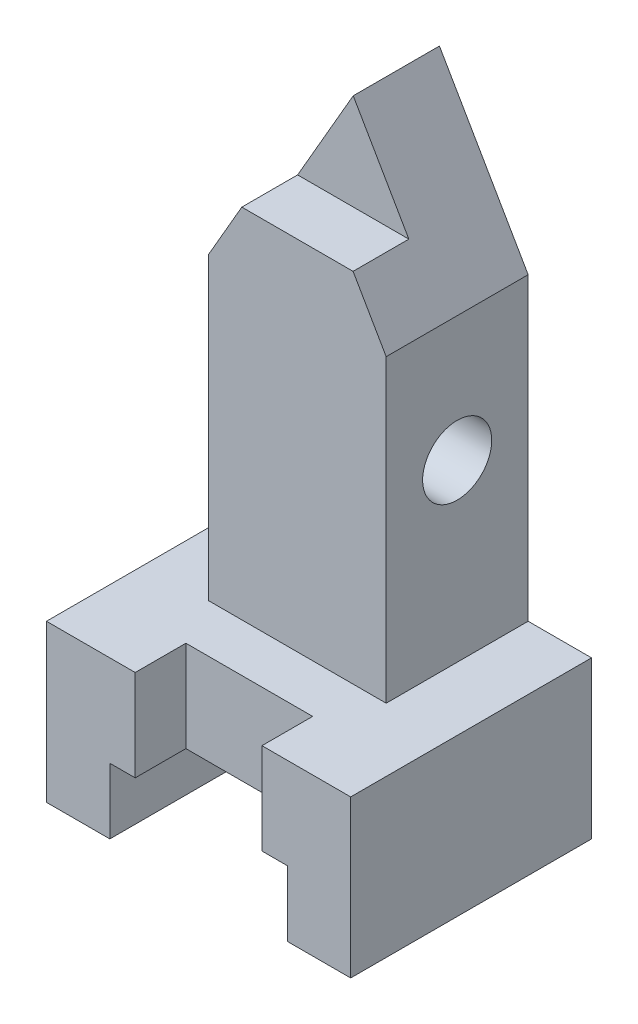
ISO-10303-21;
HEADER;
FILE_DESCRIPTION(('STEP AP214'),'2;1');
FILE_NAME('part.step','',(''),(''),'','','');
FILE_SCHEMA(('AUTOMOTIVE_DESIGN { 1 0 10303 214 1 1 1 1 }'));
ENDSEC;
DATA;
#1=APPLICATION_CONTEXT('core data for automotive mechanical design processes');
#2=APPLICATION_PROTOCOL_DEFINITION('international standard','automotive_design',2000,#1);
#3=PRODUCT_CONTEXT('',#1,'mechanical');
#4=PRODUCT('Part','Part','',(#3));
#5=PRODUCT_RELATED_PRODUCT_CATEGORY('part','',(#4));
#6=PRODUCT_DEFINITION_FORMATION('','',#4);
#7=PRODUCT_DEFINITION_CONTEXT('part definition',#1,'design');
#8=PRODUCT_DEFINITION('design','',#6,#7);
#9=PRODUCT_DEFINITION_SHAPE('','',#8);
#10=(LENGTH_UNIT() NAMED_UNIT(*) SI_UNIT(.MILLI.,.METRE.));
#11=(NAMED_UNIT(*) PLANE_ANGLE_UNIT() SI_UNIT($,.RADIAN.));
#12=(NAMED_UNIT(*) SI_UNIT($,.STERADIAN.) SOLID_ANGLE_UNIT());
#13=UNCERTAINTY_MEASURE_WITH_UNIT(LENGTH_MEASURE(1.E-05),#10,'distance_accuracy_value','');
#14=(GEOMETRIC_REPRESENTATION_CONTEXT(3) GLOBAL_UNCERTAINTY_ASSIGNED_CONTEXT((#13)) GLOBAL_UNIT_ASSIGNED_CONTEXT((#10,
#11,#12)) REPRESENTATION_CONTEXT('',''));
#15=CARTESIAN_POINT('',(0.,0.,0.));
#16=DIRECTION('',(0.,0.,1.));
#17=DIRECTION('',(1.,0.,0.));
#18=AXIS2_PLACEMENT_3D('',#15,#16,#17);
#19=CARTESIAN_POINT('',(0.,0.,53.6));
#20=DIRECTION('',(0.,0.,1.));
#21=DIRECTION('',(1.,0.,0.));
#22=AXIS2_PLACEMENT_3D('',#19,#20,#21);
#23=PLANE('',#22);
#24=DIRECTION('',(0.,1.,0.));
#25=VECTOR('',#24,1.);
#26=CARTESIAN_POINT('',(20.,0.,53.6));
#27=LINE('',#26,#25);
#28=CARTESIAN_POINT('',(20.,-28.8,53.6));
#29=VERTEX_POINT('',#28);
#30=CARTESIAN_POINT('',(20.,0.,53.6));
#31=VERTEX_POINT('',#30);
#32=EDGE_CURVE('E43',#29,#31,#27,.T.);
#33=ORIENTED_EDGE('',*,*,#32,.F.);
#34=DIRECTION('',(1.,0.,0.));
#35=VECTOR('',#34,1.);
#36=CARTESIAN_POINT('',(0.,-28.8,53.6));
#37=LINE('',#36,#35);
#38=CARTESIAN_POINT('',(28.,-28.8,53.6));
#39=VERTEX_POINT('',#38);
#40=EDGE_CURVE('E190',#29,#39,#37,.T.);
#41=ORIENTED_EDGE('',*,*,#40,.T.);
#42=DIRECTION('',(0.,-1.,0.));
#43=VECTOR('',#42,1.);
#44=CARTESIAN_POINT('',(28.,0.,53.6));
#45=LINE('',#44,#43);
#46=CARTESIAN_POINT('',(28.,-49.4898841207361,53.6));
#47=VERTEX_POINT('',#46);
#48=EDGE_CURVE('E189',#39,#47,#45,.T.);
#49=ORIENTED_EDGE('',*,*,#48,.T.);
#50=DIRECTION('',(1.,0.,0.));
#51=VECTOR('',#50,1.);
#52=CARTESIAN_POINT('',(0.,-49.4898841207361,53.6));
#53=LINE('',#52,#51);
#54=CARTESIAN_POINT('',(48.,-49.4898841207361,53.6));
#55=VERTEX_POINT('',#54);
#56=EDGE_CURVE('E315',#47,#55,#53,.T.);
#57=ORIENTED_EDGE('',*,*,#56,.T.);
#58=DIRECTION('',(0.,1.,0.));
#59=VECTOR('',#58,1.);
#60=CARTESIAN_POINT('',(48.,0.,53.6));
#61=LINE('',#60,#59);
#62=CARTESIAN_POINT('',(48.,0.,53.6));
#63=VERTEX_POINT('',#62);
#64=EDGE_CURVE('E311',#55,#63,#61,.T.);
#65=ORIENTED_EDGE('',*,*,#64,.T.);
#66=DIRECTION('',(1.,0.,0.));
#67=VECTOR('',#66,1.);
#68=CARTESIAN_POINT('',(0.,0.,53.6));
#69=LINE('',#68,#67);
#70=EDGE_CURVE('E306',#31,#63,#69,.T.);
#71=ORIENTED_EDGE('',*,*,#70,.F.);
#72=EDGE_LOOP('',(#33,#41,#49,#57,#65,#71));
#73=FACE_BOUND('',#72,.T.);
#74=ADVANCED_FACE('F35',(#73),#23,.T.);
#75=CARTESIAN_POINT('',(28.,94.7025773880715,22.4));
#76=DIRECTION('',(-1.,0.,0.));
#77=DIRECTION('',(0.,-1.,0.));
#78=AXIS2_PLACEMENT_3D('',#75,#76,#77);
#79=PLANE('',#78);
#80=CARTESIAN_POINT('',(28.,55.2,0.));
#81=DIRECTION('',(1.,0.,0.));
#82=DIRECTION('',(0.,1.,0.));
#83=AXIS2_PLACEMENT_3D('',#80,#81,#82);
#84=CIRCLE('',#83,10.9082116021349);
#85=CARTESIAN_POINT('',(28.,66.1082116021349,0.));
#86=VERTEX_POINT('',#85);
#87=EDGE_CURVE('E249',#86,#86,#84,.T.);
#88=ORIENTED_EDGE('',*,*,#87,.F.);
#89=EDGE_LOOP('',(#88));
#90=FACE_BOUND('',#89,.T.);
#91=DIRECTION('',(0.,1.,0.));
#92=VECTOR('',#91,1.);
#93=CARTESIAN_POINT('',(28.,94.7025773880715,-22.4));
#94=LINE('',#93,#92);
#95=CARTESIAN_POINT('',(28.,0.,-22.4));
#96=VERTEX_POINT('',#95);
#97=CARTESIAN_POINT('',(28.,94.7025773880715,-22.4));
#98=VERTEX_POINT('',#97);
#99=EDGE_CURVE('E253',#96,#98,#94,.T.);
#100=ORIENTED_EDGE('',*,*,#99,.T.);
#101=DIRECTION('',(0.,0.,-1.));
#102=VECTOR('',#101,1.);
#103=CARTESIAN_POINT('',(28.,94.7025773880715,22.4));
#104=LINE('',#103,#102);
#105=CARTESIAN_POINT('',(28.,94.7025773880715,22.4));
#106=VERTEX_POINT('',#105);
#107=EDGE_CURVE('E287',#106,#98,#104,.T.);
#108=ORIENTED_EDGE('',*,*,#107,.F.);
#109=DIRECTION('',(0.,1.,0.));
#110=VECTOR('',#109,1.);
#111=CARTESIAN_POINT('',(28.,94.7025773880715,22.4));
#112=LINE('',#111,#110);
#113=CARTESIAN_POINT('',(28.,0.,22.4));
#114=VERTEX_POINT('',#113);
#115=EDGE_CURVE('E256',#114,#106,#112,.T.);
#116=ORIENTED_EDGE('',*,*,#115,.F.);
#117=DIRECTION('',(0.,0.,-1.));
#118=VECTOR('',#117,1.);
#119=CARTESIAN_POINT('',(28.,0.,22.4));
#120=LINE('',#119,#118);
#121=EDGE_CURVE('E269',#114,#96,#120,.T.);
#122=ORIENTED_EDGE('',*,*,#121,.T.);
#123=EDGE_LOOP('',(#100,#108,#116,#122));
#124=FACE_BOUND('',#123,.T.);
#125=ADVANCED_FACE('F37',(#90,#124),#79,.F.);
#126=CARTESIAN_POINT('',(17.6669182372025,112.6,22.4));
#127=DIRECTION('',(-0.866025403784438,-0.5,0.));
#128=DIRECTION('',(0.5,-0.866025403784438,0.));
#129=AXIS2_PLACEMENT_3D('',#126,#127,#128);
#130=PLANE('',#129);
#131=DIRECTION('',(-0.5,0.866025403784438,0.));
#132=VECTOR('',#131,1.);
#133=CARTESIAN_POINT('',(17.6669182372025,112.6,4.8));
#134=LINE('',#133,#132);
#135=CARTESIAN_POINT('',(17.5514481833646,112.8,4.8));
#136=VERTEX_POINT('',#135);
#137=CARTESIAN_POINT('',(0.,143.2,4.8));
#138=VERTEX_POINT('',#137);
#139=EDGE_CURVE('E247',#136,#138,#134,.T.);
#140=ORIENTED_EDGE('',*,*,#139,.F.);
#141=DIRECTION('',(0.,0.,1.));
#142=VECTOR('',#141,1.);
#143=CARTESIAN_POINT('',(17.5514481833646,112.8,22.4));
#144=LINE('',#143,#142);
#145=CARTESIAN_POINT('',(17.5514481833646,112.8,22.4));
#146=VERTEX_POINT('',#145);
#147=EDGE_CURVE('E244',#136,#146,#144,.T.);
#148=ORIENTED_EDGE('',*,*,#147,.T.);
#149=DIRECTION('',(-0.500000000000001,0.866025403784438,0.));
#150=VECTOR('',#149,1.);
#151=CARTESIAN_POINT('',(17.6669182372025,112.6,22.4));
#152=LINE('',#151,#150);
#153=EDGE_CURVE('E259',#106,#146,#152,.T.);
#154=ORIENTED_EDGE('',*,*,#153,.F.);
#155=ORIENTED_EDGE('',*,*,#107,.T.);
#156=DIRECTION('',(-0.5,0.866025403784438,0.));
#157=VECTOR('',#156,1.);
#158=CARTESIAN_POINT('',(17.6669182372025,112.6,-22.4));
#159=LINE('',#158,#157);
#160=CARTESIAN_POINT('',(0.,143.2,-22.4));
#161=VERTEX_POINT('',#160);
#162=EDGE_CURVE('E272',#98,#161,#159,.T.);
#163=ORIENTED_EDGE('',*,*,#162,.T.);
#164=DIRECTION('',(0.,0.,-1.));
#165=VECTOR('',#164,1.);
#166=CARTESIAN_POINT('',(0.,143.2,22.4));
#167=LINE('',#166,#165);
#168=EDGE_CURVE('E285',#138,#161,#167,.T.);
#169=ORIENTED_EDGE('',*,*,#168,.F.);
#170=EDGE_LOOP('',(#140,#148,#154,#155,#163,#169));
#171=FACE_BOUND('',#170,.T.);
#172=ADVANCED_FACE('F372',(#171),#130,.F.);
#173=CARTESIAN_POINT('',(-17.6669182372025,112.6,22.4));
#174=DIRECTION('',(0.866025403784439,-0.5,0.));
#175=DIRECTION('',(0.5,0.866025403784439,0.));
#176=AXIS2_PLACEMENT_3D('',#173,#174,#175);
#177=PLANE('',#176);
#178=DIRECTION('',(-0.5,-0.866025403784439,0.));
#179=VECTOR('',#178,1.);
#180=CARTESIAN_POINT('',(0.,143.2,22.4));
#181=LINE('',#180,#179);
#182=CARTESIAN_POINT('',(-17.5514481833646,112.8,22.4));
#183=VERTEX_POINT('',#182);
#184=CARTESIAN_POINT('',(-28.,94.7025773880714,22.4));
#185=VERTEX_POINT('',#184);
#186=EDGE_CURVE('E263',#183,#185,#181,.T.);
#187=ORIENTED_EDGE('',*,*,#186,.F.);
#188=DIRECTION('',(0.,0.,-1.));
#189=VECTOR('',#188,1.);
#190=CARTESIAN_POINT('',(-17.5514481833646,112.8,22.4));
#191=LINE('',#190,#189);
#192=CARTESIAN_POINT('',(-17.5514481833646,112.8,4.8));
#193=VERTEX_POINT('',#192);
#194=EDGE_CURVE('E58',#183,#193,#191,.T.);
#195=ORIENTED_EDGE('',*,*,#194,.T.);
#196=DIRECTION('',(-0.5,-0.866025403784439,0.));
#197=VECTOR('',#196,1.);
#198=CARTESIAN_POINT('',(-17.6669182372025,112.6,4.8));
#199=LINE('',#198,#197);
#200=EDGE_CURVE('E173',#138,#193,#199,.T.);
#201=ORIENTED_EDGE('',*,*,#200,.F.);
#202=ORIENTED_EDGE('',*,*,#168,.T.);
#203=DIRECTION('',(-0.5,-0.866025403784438,0.));
#204=VECTOR('',#203,1.);
#205=CARTESIAN_POINT('',(-17.6669182372025,112.6,-22.4));
#206=LINE('',#205,#204);
#207=CARTESIAN_POINT('',(-28.,94.7025773880714,-22.4));
#208=VERTEX_POINT('',#207);
#209=EDGE_CURVE('E275',#161,#208,#206,.T.);
#210=ORIENTED_EDGE('',*,*,#209,.T.);
#211=DIRECTION('',(0.,0.,-1.));
#212=VECTOR('',#211,1.);
#213=CARTESIAN_POINT('',(-28.,94.7025773880714,22.4));
#214=LINE('',#213,#212);
#215=EDGE_CURVE('E282',#185,#208,#214,.T.);
#216=ORIENTED_EDGE('',*,*,#215,.F.);
#217=EDGE_LOOP('',(#187,#195,#201,#202,#210,#216));
#218=FACE_BOUND('',#217,.T.);
#219=ADVANCED_FACE('F376',(#218),#177,.F.);
#220=CARTESIAN_POINT('',(-28.,94.7025773880714,22.4));
#221=DIRECTION('',(1.,0.,0.));
#222=DIRECTION('',(0.,1.,0.));
#223=AXIS2_PLACEMENT_3D('',#220,#221,#222);
#224=PLANE('',#223);
#225=CARTESIAN_POINT('',(-28.,55.2,0.));
#226=DIRECTION('',(1.,0.,0.));
#227=DIRECTION('',(0.,1.,0.));
#228=AXIS2_PLACEMENT_3D('',#225,#226,#227);
#229=CIRCLE('',#228,10.9082116021349);
#230=CARTESIAN_POINT('',(-28.,66.1082116021349,0.));
#231=VERTEX_POINT('',#230);
#232=EDGE_CURVE('E250',#231,#231,#229,.T.);
#233=ORIENTED_EDGE('',*,*,#232,.T.);
#234=EDGE_LOOP('',(#233));
#235=FACE_BOUND('',#234,.T.);
#236=DIRECTION('',(0.,-1.,0.));
#237=VECTOR('',#236,1.);
#238=CARTESIAN_POINT('',(-28.,94.7025773880714,-22.4));
#239=LINE('',#238,#237);
#240=CARTESIAN_POINT('',(-28.,0.,-22.4));
#241=VERTEX_POINT('',#240);
#242=EDGE_CURVE('E260',#208,#241,#239,.T.);
#243=ORIENTED_EDGE('',*,*,#242,.T.);
#244=DIRECTION('',(0.,0.,-1.));
#245=VECTOR('',#244,1.);
#246=CARTESIAN_POINT('',(-28.,0.,22.4));
#247=LINE('',#246,#245);
#248=CARTESIAN_POINT('',(-28.,0.,22.4));
#249=VERTEX_POINT('',#248);
#250=EDGE_CURVE('E279',#249,#241,#247,.T.);
#251=ORIENTED_EDGE('',*,*,#250,.F.);
#252=DIRECTION('',(0.,-1.,0.));
#253=VECTOR('',#252,1.);
#254=CARTESIAN_POINT('',(-28.,94.7025773880714,22.4));
#255=LINE('',#254,#253);
#256=EDGE_CURVE('E265',#185,#249,#255,.T.);
#257=ORIENTED_EDGE('',*,*,#256,.F.);
#258=ORIENTED_EDGE('',*,*,#215,.T.);
#259=EDGE_LOOP('',(#243,#251,#257,#258));
#260=FACE_BOUND('',#259,.T.);
#261=ADVANCED_FACE('F359',(#235,#260),#224,.F.);
#262=CARTESIAN_POINT('',(0.,0.,22.4));
#263=DIRECTION('',(0.,0.,-1.));
#264=DIRECTION('',(-1.,0.,0.));
#265=AXIS2_PLACEMENT_3D('',#262,#263,#264);
#266=PLANE('',#265);
#267=ORIENTED_EDGE('',*,*,#153,.T.);
#268=DIRECTION('',(-1.,0.,0.));
#269=VECTOR('',#268,1.);
#270=CARTESIAN_POINT('',(0.,112.8,22.4));
#271=LINE('',#270,#269);
#272=EDGE_CURVE('E290',#146,#183,#271,.T.);
#273=ORIENTED_EDGE('',*,*,#272,.T.);
#274=ORIENTED_EDGE('',*,*,#186,.T.);
#275=ORIENTED_EDGE('',*,*,#256,.T.);
#276=DIRECTION('',(1.,0.,0.));
#277=VECTOR('',#276,1.);
#278=CARTESIAN_POINT('',(0.,0.,22.4));
#279=LINE('',#278,#277);
#280=EDGE_CURVE('E267',#249,#114,#279,.T.);
#281=ORIENTED_EDGE('',*,*,#280,.T.);
#282=ORIENTED_EDGE('',*,*,#115,.T.);
#283=EDGE_LOOP('',(#267,#273,#274,#275,#281,#282));
#284=FACE_BOUND('',#283,.T.);
#285=ADVANCED_FACE('F367',(#284),#266,.F.);
#286=CARTESIAN_POINT('',(0.,0.,-22.4));
#287=DIRECTION('',(0.,0.,-1.));
#288=DIRECTION('',(-1.,0.,0.));
#289=AXIS2_PLACEMENT_3D('',#286,#287,#288);
#290=PLANE('',#289);
#291=ORIENTED_EDGE('',*,*,#99,.F.);
#292=DIRECTION('',(1.,0.,0.));
#293=VECTOR('',#292,1.);
#294=CARTESIAN_POINT('',(0.,0.,-22.4));
#295=LINE('',#294,#293);
#296=CARTESIAN_POINT('',(48.,0.,-22.4));
#297=VERTEX_POINT('',#296);
#298=EDGE_CURVE('E203',#96,#297,#295,.T.);
#299=ORIENTED_EDGE('',*,*,#298,.T.);
#300=DIRECTION('',(0.,1.,0.));
#301=VECTOR('',#300,1.);
#302=CARTESIAN_POINT('',(48.,0.,-22.4));
#303=LINE('',#302,#301);
#304=CARTESIAN_POINT('',(48.,-49.4898841207361,-22.4));
#305=VERTEX_POINT('',#304);
#306=EDGE_CURVE('E200',#305,#297,#303,.T.);
#307=ORIENTED_EDGE('',*,*,#306,.F.);
#308=DIRECTION('',(1.,0.,0.));
#309=VECTOR('',#308,1.);
#310=CARTESIAN_POINT('',(0.,-49.4898841207361,-22.4));
#311=LINE('',#310,#309);
#312=CARTESIAN_POINT('',(28.,-49.4898841207361,-22.4));
#313=VERTEX_POINT('',#312);
#314=EDGE_CURVE('E193',#313,#305,#311,.T.);
#315=ORIENTED_EDGE('',*,*,#314,.F.);
#316=DIRECTION('',(0.,-1.,0.));
#317=VECTOR('',#316,1.);
#318=CARTESIAN_POINT('',(28.,0.,-22.4));
#319=LINE('',#318,#317);
#320=CARTESIAN_POINT('',(28.,-28.8,-22.4));
#321=VERTEX_POINT('',#320);
#322=EDGE_CURVE('E219',#321,#313,#319,.T.);
#323=ORIENTED_EDGE('',*,*,#322,.F.);
#324=DIRECTION('',(1.,0.,0.));
#325=VECTOR('',#324,1.);
#326=CARTESIAN_POINT('',(0.,-28.8,-22.4));
#327=LINE('',#326,#325);
#328=CARTESIAN_POINT('',(-28.,-28.8,-22.4));
#329=VERTEX_POINT('',#328);
#330=EDGE_CURVE('E216',#329,#321,#327,.T.);
#331=ORIENTED_EDGE('',*,*,#330,.F.);
#332=DIRECTION('',(0.,1.,0.));
#333=VECTOR('',#332,1.);
#334=CARTESIAN_POINT('',(-28.,0.,-22.4));
#335=LINE('',#334,#333);
#336=CARTESIAN_POINT('',(-28.,-49.4898841207361,-22.4));
#337=VERTEX_POINT('',#336);
#338=EDGE_CURVE('E213',#337,#329,#335,.T.);
#339=ORIENTED_EDGE('',*,*,#338,.F.);
#340=DIRECTION('',(1.,0.,0.));
#341=VECTOR('',#340,1.);
#342=CARTESIAN_POINT('',(0.,-49.4898841207361,-22.4));
#343=LINE('',#342,#341);
#344=CARTESIAN_POINT('',(-48.,-49.4898841207361,-22.4));
#345=VERTEX_POINT('',#344);
#346=EDGE_CURVE('E210',#345,#337,#343,.T.);
#347=ORIENTED_EDGE('',*,*,#346,.F.);
#348=DIRECTION('',(0.,-1.,0.));
#349=VECTOR('',#348,1.);
#350=CARTESIAN_POINT('',(-48.,0.,-22.4));
#351=LINE('',#350,#349);
#352=CARTESIAN_POINT('',(-48.,0.,-22.4));
#353=VERTEX_POINT('',#352);
#354=EDGE_CURVE('E207',#353,#345,#351,.T.);
#355=ORIENTED_EDGE('',*,*,#354,.F.);
#356=EDGE_CURVE('E204',#353,#241,#295,.T.);
#357=ORIENTED_EDGE('',*,*,#356,.T.);
#358=ORIENTED_EDGE('',*,*,#242,.F.);
#359=ORIENTED_EDGE('',*,*,#209,.F.);
#360=ORIENTED_EDGE('',*,*,#162,.F.);
#361=EDGE_LOOP('',(#291,#299,#307,#315,#323,#331,#339,#347,#355,#357,#358,#359,#360));
#362=FACE_BOUND('',#361,.T.);
#363=ADVANCED_FACE('F331',(#362),#290,.T.);
#364=CARTESIAN_POINT('',(-28.,55.2,0.));
#365=DIRECTION('',(1.,0.,0.));
#366=DIRECTION('',(0.,1.,0.));
#367=AXIS2_PLACEMENT_3D('',#364,#365,#366);
#368=CYLINDRICAL_SURFACE('',#367,10.9082116021349);
#369=ORIENTED_EDGE('',*,*,#232,.F.);
#370=EDGE_LOOP('',(#369));
#371=FACE_BOUND('',#370,.T.);
#372=ORIENTED_EDGE('',*,*,#87,.T.);
#373=EDGE_LOOP('',(#372));
#374=FACE_BOUND('',#373,.T.);
#375=ADVANCED_FACE('F388',(#371,#374),#368,.F.);
#376=CARTESIAN_POINT('',(0.,0.,4.8));
#377=DIRECTION('',(0.,0.,1.));
#378=DIRECTION('',(1.,0.,0.));
#379=AXIS2_PLACEMENT_3D('',#376,#377,#378);
#380=PLANE('',#379);
#381=ORIENTED_EDGE('',*,*,#139,.T.);
#382=ORIENTED_EDGE('',*,*,#200,.T.);
#383=DIRECTION('',(1.,0.,0.));
#384=VECTOR('',#383,1.);
#385=CARTESIAN_POINT('',(-37.1883163370009,112.8,4.8));
#386=LINE('',#385,#384);
#387=EDGE_CURVE('E225',#193,#136,#386,.T.);
#388=ORIENTED_EDGE('',*,*,#387,.T.);
#389=EDGE_LOOP('',(#381,#382,#388));
#390=FACE_BOUND('',#389,.T.);
#391=ADVANCED_FACE('F379',(#390),#380,.T.);
#392=CARTESIAN_POINT('',(-37.1883163370009,112.8,4.8));
#393=DIRECTION('',(0.,-1.,0.));
#394=DIRECTION('',(0.,0.,-1.));
#395=AXIS2_PLACEMENT_3D('',#392,#393,#394);
#396=PLANE('',#395);
#397=ORIENTED_EDGE('',*,*,#387,.F.);
#398=ORIENTED_EDGE('',*,*,#194,.F.);
#399=ORIENTED_EDGE('',*,*,#272,.F.);
#400=ORIENTED_EDGE('',*,*,#147,.F.);
#401=EDGE_LOOP('',(#397,#398,#399,#400));
#402=FACE_BOUND('',#401,.T.);
#403=ADVANCED_FACE('F380',(#402),#396,.F.);
#404=CARTESIAN_POINT('',(0.,-49.4898841207361,-22.4));
#405=DIRECTION('',(0.,-1.,0.));
#406=DIRECTION('',(0.,0.,-1.));
#407=AXIS2_PLACEMENT_3D('',#404,#405,#406);
#408=PLANE('',#407);
#409=DIRECTION('',(0.,0.,1.));
#410=VECTOR('',#409,1.);
#411=CARTESIAN_POINT('',(48.,-49.4898841207361,-22.4));
#412=LINE('',#411,#410);
#413=EDGE_CURVE('E222',#305,#55,#412,.T.);
#414=ORIENTED_EDGE('',*,*,#413,.T.);
#415=ORIENTED_EDGE('',*,*,#56,.F.);
#416=DIRECTION('',(0.,0.,1.));
#417=VECTOR('',#416,1.);
#418=CARTESIAN_POINT('',(28.,-49.4898841207361,-22.4));
#419=LINE('',#418,#417);
#420=EDGE_CURVE('E223',#313,#47,#419,.T.);
#421=ORIENTED_EDGE('',*,*,#420,.F.);
#422=ORIENTED_EDGE('',*,*,#314,.T.);
#423=EDGE_LOOP('',(#414,#415,#421,#422));
#424=FACE_BOUND('',#423,.T.);
#425=ADVANCED_FACE('F340',(#424),#408,.T.);
#426=CARTESIAN_POINT('',(28.,0.,-22.4));
#427=DIRECTION('',(-1.,0.,0.));
#428=DIRECTION('',(0.,-1.,0.));
#429=AXIS2_PLACEMENT_3D('',#426,#427,#428);
#430=PLANE('',#429);
#431=ORIENTED_EDGE('',*,*,#420,.T.);
#432=ORIENTED_EDGE('',*,*,#48,.F.);
#433=DIRECTION('',(0.,0.,1.));
#434=VECTOR('',#433,1.);
#435=CARTESIAN_POINT('',(28.,-28.8,-22.4));
#436=LINE('',#435,#434);
#437=EDGE_CURVE('E226',#321,#39,#436,.T.);
#438=ORIENTED_EDGE('',*,*,#437,.F.);
#439=ORIENTED_EDGE('',*,*,#322,.T.);
#440=EDGE_LOOP('',(#431,#432,#438,#439));
#441=FACE_BOUND('',#440,.T.);
#442=ADVANCED_FACE('F336',(#441),#430,.T.);
#443=CARTESIAN_POINT('',(0.,-28.8,-22.4));
#444=DIRECTION('',(0.,-1.,0.));
#445=DIRECTION('',(0.,0.,-1.));
#446=AXIS2_PLACEMENT_3D('',#443,#444,#445);
#447=PLANE('',#446);
#448=DIRECTION('',(0.,0.,1.));
#449=VECTOR('',#448,1.);
#450=CARTESIAN_POINT('',(20.,-28.8,-22.4));
#451=LINE('',#450,#449);
#452=CARTESIAN_POINT('',(20.,-28.8,37.6));
#453=VERTEX_POINT('',#452);
#454=EDGE_CURVE('E298',#453,#29,#451,.T.);
#455=ORIENTED_EDGE('',*,*,#454,.F.);
#456=DIRECTION('',(-1.,0.,0.));
#457=VECTOR('',#456,1.);
#458=CARTESIAN_POINT('',(0.,-28.8,37.6));
#459=LINE('',#458,#457);
#460=CARTESIAN_POINT('',(-20.,-28.8,37.6));
#461=VERTEX_POINT('',#460);
#462=EDGE_CURVE('E181',#453,#461,#459,.T.);
#463=ORIENTED_EDGE('',*,*,#462,.T.);
#464=DIRECTION('',(0.,0.,-1.));
#465=VECTOR('',#464,1.);
#466=CARTESIAN_POINT('',(-20.,-28.8,-22.4));
#467=LINE('',#466,#465);
#468=CARTESIAN_POINT('',(-20.,-28.8,53.6));
#469=VERTEX_POINT('',#468);
#470=EDGE_CURVE('E167',#469,#461,#467,.T.);
#471=ORIENTED_EDGE('',*,*,#470,.F.);
#472=CARTESIAN_POINT('',(-28.,-28.8,53.6));
#473=VERTEX_POINT('',#472);
#474=EDGE_CURVE('E180',#473,#469,#37,.T.);
#475=ORIENTED_EDGE('',*,*,#474,.F.);
#476=DIRECTION('',(0.,0.,1.));
#477=VECTOR('',#476,1.);
#478=CARTESIAN_POINT('',(-28.,-28.8,-22.4));
#479=LINE('',#478,#477);
#480=EDGE_CURVE('E229',#329,#473,#479,.T.);
#481=ORIENTED_EDGE('',*,*,#480,.F.);
#482=ORIENTED_EDGE('',*,*,#330,.T.);
#483=ORIENTED_EDGE('',*,*,#437,.T.);
#484=ORIENTED_EDGE('',*,*,#40,.F.);
#485=EDGE_LOOP('',(#455,#463,#471,#475,#481,#482,#483,#484));
#486=FACE_BOUND('',#485,.T.);
#487=ADVANCED_FACE('F179',(#486),#447,.T.);
#488=CARTESIAN_POINT('',(-28.,0.,-22.4));
#489=DIRECTION('',(1.,0.,0.));
#490=DIRECTION('',(0.,1.,0.));
#491=AXIS2_PLACEMENT_3D('',#488,#489,#490);
#492=PLANE('',#491);
#493=ORIENTED_EDGE('',*,*,#480,.T.);
#494=DIRECTION('',(0.,1.,0.));
#495=VECTOR('',#494,1.);
#496=CARTESIAN_POINT('',(-28.,0.,53.6));
#497=LINE('',#496,#495);
#498=CARTESIAN_POINT('',(-28.,-49.4898841207361,53.6));
#499=VERTEX_POINT('',#498);
#500=EDGE_CURVE('E188',#499,#473,#497,.T.);
#501=ORIENTED_EDGE('',*,*,#500,.F.);
#502=DIRECTION('',(0.,0.,1.));
#503=VECTOR('',#502,1.);
#504=CARTESIAN_POINT('',(-28.,-49.4898841207361,-22.4));
#505=LINE('',#504,#503);
#506=EDGE_CURVE('E231',#337,#499,#505,.T.);
#507=ORIENTED_EDGE('',*,*,#506,.F.);
#508=ORIENTED_EDGE('',*,*,#338,.T.);
#509=EDGE_LOOP('',(#493,#501,#507,#508));
#510=FACE_BOUND('',#509,.T.);
#511=ADVANCED_FACE('F325',(#510),#492,.T.);
#512=CARTESIAN_POINT('',(0.,-49.4898841207361,-22.4));
#513=DIRECTION('',(0.,-1.,0.));
#514=DIRECTION('',(0.,0.,-1.));
#515=AXIS2_PLACEMENT_3D('',#512,#513,#514);
#516=PLANE('',#515);
#517=ORIENTED_EDGE('',*,*,#506,.T.);
#518=DIRECTION('',(1.,0.,0.));
#519=VECTOR('',#518,1.);
#520=CARTESIAN_POINT('',(0.,-49.4898841207361,53.6));
#521=LINE('',#520,#519);
#522=CARTESIAN_POINT('',(-48.,-49.4898841207361,53.6));
#523=VERTEX_POINT('',#522);
#524=EDGE_CURVE('E320',#523,#499,#521,.T.);
#525=ORIENTED_EDGE('',*,*,#524,.F.);
#526=DIRECTION('',(0.,0.,1.));
#527=VECTOR('',#526,1.);
#528=CARTESIAN_POINT('',(-48.,-49.4898841207361,-22.4));
#529=LINE('',#528,#527);
#530=EDGE_CURVE('E233',#345,#523,#529,.T.);
#531=ORIENTED_EDGE('',*,*,#530,.F.);
#532=ORIENTED_EDGE('',*,*,#346,.T.);
#533=EDGE_LOOP('',(#517,#525,#531,#532));
#534=FACE_BOUND('',#533,.T.);
#535=ADVANCED_FACE('F354',(#534),#516,.T.);
#536=CARTESIAN_POINT('',(-48.,0.,-22.4));
#537=DIRECTION('',(-1.,0.,0.));
#538=DIRECTION('',(0.,0.,1.));
#539=AXIS2_PLACEMENT_3D('',#536,#537,#538);
#540=PLANE('',#539);
#541=ORIENTED_EDGE('',*,*,#530,.T.);
#542=DIRECTION('',(0.,-1.,0.));
#543=VECTOR('',#542,1.);
#544=CARTESIAN_POINT('',(-48.,0.,53.6));
#545=LINE('',#544,#543);
#546=CARTESIAN_POINT('',(-48.,0.,53.6));
#547=VERTEX_POINT('',#546);
#548=EDGE_CURVE('E314',#547,#523,#545,.T.);
#549=ORIENTED_EDGE('',*,*,#548,.F.);
#550=DIRECTION('',(0.,0.,1.));
#551=VECTOR('',#550,1.);
#552=CARTESIAN_POINT('',(-48.,0.,-22.4));
#553=LINE('',#552,#551);
#554=EDGE_CURVE('E235',#353,#547,#553,.T.);
#555=ORIENTED_EDGE('',*,*,#554,.F.);
#556=ORIENTED_EDGE('',*,*,#354,.T.);
#557=EDGE_LOOP('',(#541,#549,#555,#556));
#558=FACE_BOUND('',#557,.T.);
#559=ADVANCED_FACE('F353',(#558),#540,.T.);
#560=CARTESIAN_POINT('',(0.,0.,-22.4));
#561=DIRECTION('',(0.,-1.,0.));
#562=DIRECTION('',(0.,0.,-1.));
#563=AXIS2_PLACEMENT_3D('',#560,#561,#562);
#564=PLANE('',#563);
#565=DIRECTION('',(-1.,0.,0.));
#566=VECTOR('',#565,1.);
#567=CARTESIAN_POINT('',(0.,0.,37.6));
#568=LINE('',#567,#566);
#569=CARTESIAN_POINT('',(20.,0.,37.6));
#570=VERTEX_POINT('',#569);
#571=CARTESIAN_POINT('',(-20.,0.,37.6));
#572=VERTEX_POINT('',#571);
#573=EDGE_CURVE('E11',#570,#572,#568,.T.);
#574=ORIENTED_EDGE('',*,*,#573,.F.);
#575=DIRECTION('',(0.,0.,1.));
#576=VECTOR('',#575,1.);
#577=CARTESIAN_POINT('',(20.,0.,-22.4));
#578=LINE('',#577,#576);
#579=EDGE_CURVE('E182',#570,#31,#578,.T.);
#580=ORIENTED_EDGE('',*,*,#579,.T.);
#581=ORIENTED_EDGE('',*,*,#70,.T.);
#582=DIRECTION('',(0.,0.,1.));
#583=VECTOR('',#582,1.);
#584=CARTESIAN_POINT('',(48.,0.,-22.4));
#585=LINE('',#584,#583);
#586=EDGE_CURVE('E237',#297,#63,#585,.T.);
#587=ORIENTED_EDGE('',*,*,#586,.F.);
#588=ORIENTED_EDGE('',*,*,#298,.F.);
#589=ORIENTED_EDGE('',*,*,#121,.F.);
#590=ORIENTED_EDGE('',*,*,#280,.F.);
#591=ORIENTED_EDGE('',*,*,#250,.T.);
#592=ORIENTED_EDGE('',*,*,#356,.F.);
#593=ORIENTED_EDGE('',*,*,#554,.T.);
#594=CARTESIAN_POINT('',(-20.,0.,53.6));
#595=VERTEX_POINT('',#594);
#596=EDGE_CURVE('E312',#547,#595,#69,.T.);
#597=ORIENTED_EDGE('',*,*,#596,.T.);
#598=DIRECTION('',(0.,0.,-1.));
#599=VECTOR('',#598,1.);
#600=CARTESIAN_POINT('',(-20.,0.,-22.4));
#601=LINE('',#600,#599);
#602=EDGE_CURVE('E50',#595,#572,#601,.T.);
#603=ORIENTED_EDGE('',*,*,#602,.T.);
#604=EDGE_LOOP('',(#574,#580,#581,#587,#588,#589,#590,#591,#592,#593,#597,#603));
#605=FACE_BOUND('',#604,.T.);
#606=ADVANCED_FACE('F304',(#605),#564,.F.);
#607=CARTESIAN_POINT('',(48.,0.,-22.4));
#608=DIRECTION('',(1.,0.,0.));
#609=DIRECTION('',(0.,0.,-1.));
#610=AXIS2_PLACEMENT_3D('',#607,#608,#609);
#611=PLANE('',#610);
#612=ORIENTED_EDGE('',*,*,#586,.T.);
#613=ORIENTED_EDGE('',*,*,#64,.F.);
#614=ORIENTED_EDGE('',*,*,#413,.F.);
#615=ORIENTED_EDGE('',*,*,#306,.T.);
#616=EDGE_LOOP('',(#612,#613,#614,#615));
#617=FACE_BOUND('',#616,.T.);
#618=ADVANCED_FACE('F400',(#617),#611,.T.);
#619=DIRECTION('',(0.,-1.,0.));
#620=VECTOR('',#619,1.);
#621=CARTESIAN_POINT('',(-20.,0.,53.6));
#622=LINE('',#621,#620);
#623=EDGE_CURVE('E164',#595,#469,#622,.T.);
#624=ORIENTED_EDGE('',*,*,#623,.F.);
#625=ORIENTED_EDGE('',*,*,#596,.F.);
#626=ORIENTED_EDGE('',*,*,#548,.T.);
#627=ORIENTED_EDGE('',*,*,#524,.T.);
#628=ORIENTED_EDGE('',*,*,#500,.T.);
#629=ORIENTED_EDGE('',*,*,#474,.T.);
#630=EDGE_LOOP('',(#624,#625,#626,#627,#628,#629));
#631=FACE_BOUND('',#630,.T.);
#632=ADVANCED_FACE('F185',(#631),#23,.T.);
#633=CARTESIAN_POINT('',(0.,0.,37.6));
#634=DIRECTION('',(0.,0.,1.));
#635=DIRECTION('',(1.,0.,0.));
#636=AXIS2_PLACEMENT_3D('',#633,#634,#635);
#637=PLANE('',#636);
#638=DIRECTION('',(0.,1.,0.));
#639=VECTOR('',#638,1.);
#640=CARTESIAN_POINT('',(20.,32.5118079419435,37.6));
#641=LINE('',#640,#639);
#642=EDGE_CURVE('E347',#453,#570,#641,.T.);
#643=ORIENTED_EDGE('',*,*,#642,.T.);
#644=ORIENTED_EDGE('',*,*,#573,.T.);
#645=DIRECTION('',(0.,-1.,0.));
#646=VECTOR('',#645,1.);
#647=CARTESIAN_POINT('',(-20.,32.5118079419435,37.6));
#648=LINE('',#647,#646);
#649=EDGE_CURVE('E345',#572,#461,#648,.T.);
#650=ORIENTED_EDGE('',*,*,#649,.T.);
#651=ORIENTED_EDGE('',*,*,#462,.F.);
#652=EDGE_LOOP('',(#643,#644,#650,#651));
#653=FACE_BOUND('',#652,.T.);
#654=ADVANCED_FACE('F349',(#653),#637,.T.);
#655=CARTESIAN_POINT('',(20.,32.5118079419435,37.6));
#656=DIRECTION('',(1.,0.,0.));
#657=DIRECTION('',(0.,1.,0.));
#658=AXIS2_PLACEMENT_3D('',#655,#656,#657);
#659=PLANE('',#658);
#660=ORIENTED_EDGE('',*,*,#454,.T.);
#661=ORIENTED_EDGE('',*,*,#32,.T.);
#662=ORIENTED_EDGE('',*,*,#579,.F.);
#663=ORIENTED_EDGE('',*,*,#642,.F.);
#664=EDGE_LOOP('',(#660,#661,#662,#663));
#665=FACE_BOUND('',#664,.T.);
#666=ADVANCED_FACE('F295',(#665),#659,.F.);
#667=CARTESIAN_POINT('',(-20.,32.5118079419435,37.6));
#668=DIRECTION('',(-1.,0.,0.));
#669=DIRECTION('',(0.,-1.,0.));
#670=AXIS2_PLACEMENT_3D('',#667,#668,#669);
#671=PLANE('',#670);
#672=ORIENTED_EDGE('',*,*,#470,.T.);
#673=ORIENTED_EDGE('',*,*,#649,.F.);
#674=ORIENTED_EDGE('',*,*,#602,.F.);
#675=ORIENTED_EDGE('',*,*,#623,.T.);
#676=EDGE_LOOP('',(#672,#673,#674,#675));
#677=FACE_BOUND('',#676,.T.);
#678=ADVANCED_FACE('F166',(#677),#671,.F.);
#679=CLOSED_SHELL('',(#74,#125,#172,#219,#261,#285,#363,#375,#391,#403,#425,#442,#487,#511,#535,
#559,#606,#618,#632,#654,#666,#678));
#680=MANIFOLD_SOLID_BREP('B2',#679);
#681=ADVANCED_BREP_SHAPE_REPRESENTATION('',(#18,#680),#14);
#682=SHAPE_DEFINITION_REPRESENTATION(#9,#681);
ENDSEC;
END-ISO-10303-21;
